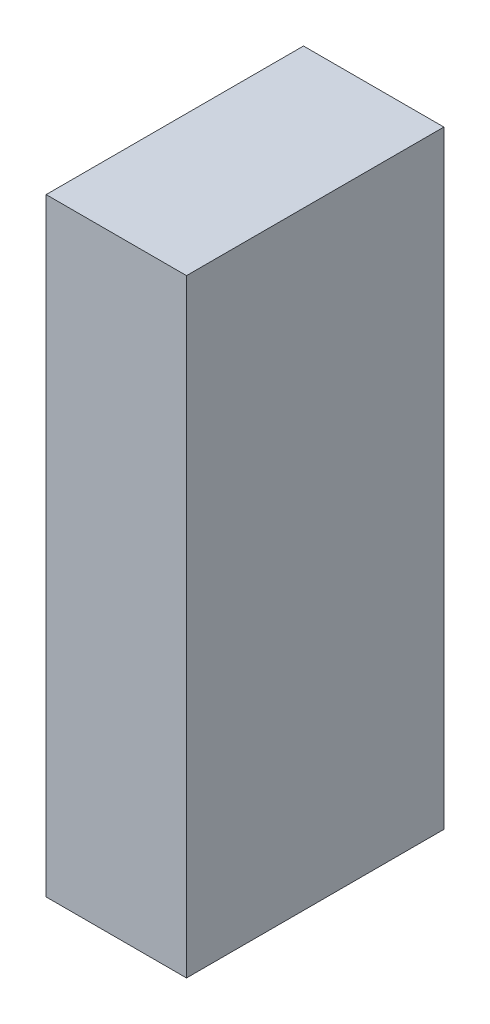
ISO-10303-21;
HEADER;
FILE_DESCRIPTION(('STEP AP214'),'2;1');
FILE_NAME('part.step','',(''),(''),'','','');
FILE_SCHEMA(('AUTOMOTIVE_DESIGN { 1 0 10303 214 1 1 1 1 }'));
ENDSEC;
DATA;
#1=APPLICATION_CONTEXT('core data for automotive mechanical design processes');
#2=APPLICATION_PROTOCOL_DEFINITION('international standard','automotive_design',2000,#1);
#3=PRODUCT_CONTEXT('',#1,'mechanical');
#4=PRODUCT('Part','Part','',(#3));
#5=PRODUCT_RELATED_PRODUCT_CATEGORY('part','',(#4));
#6=PRODUCT_DEFINITION_FORMATION('','',#4);
#7=PRODUCT_DEFINITION_CONTEXT('part definition',#1,'design');
#8=PRODUCT_DEFINITION('design','',#6,#7);
#9=PRODUCT_DEFINITION_SHAPE('','',#8);
#10=(LENGTH_UNIT() NAMED_UNIT(*) SI_UNIT(.MILLI.,.METRE.));
#11=(NAMED_UNIT(*) PLANE_ANGLE_UNIT() SI_UNIT($,.RADIAN.));
#12=(NAMED_UNIT(*) SI_UNIT($,.STERADIAN.) SOLID_ANGLE_UNIT());
#13=UNCERTAINTY_MEASURE_WITH_UNIT(LENGTH_MEASURE(1.E-05),#10,'distance_accuracy_value','');
#14=(GEOMETRIC_REPRESENTATION_CONTEXT(3) GLOBAL_UNCERTAINTY_ASSIGNED_CONTEXT((#13)) GLOBAL_UNIT_ASSIGNED_CONTEXT((#10,
#11,#12)) REPRESENTATION_CONTEXT('',''));
#15=CARTESIAN_POINT('',(0.,0.,0.));
#16=DIRECTION('',(0.,0.,1.));
#17=DIRECTION('',(1.,0.,0.));
#18=AXIS2_PLACEMENT_3D('',#15,#16,#17);
#19=CARTESIAN_POINT('',(300.,1300.,1100.));
#20=DIRECTION('',(-1.,0.,0.));
#21=DIRECTION('',(0.,-1.,0.));
#22=AXIS2_PLACEMENT_3D('',#19,#20,#21);
#23=PLANE('',#22);
#24=DIRECTION('',(0.,1.,0.));
#25=VECTOR('',#24,1.);
#26=CARTESIAN_POINT('',(300.,1300.,0.));
#27=LINE('',#26,#25);
#28=CARTESIAN_POINT('',(300.,-1300.,0.));
#29=VERTEX_POINT('',#28);
#30=CARTESIAN_POINT('',(300.,1300.,0.));
#31=VERTEX_POINT('',#30);
#32=EDGE_CURVE('E169',#29,#31,#27,.T.);
#33=ORIENTED_EDGE('',*,*,#32,.T.);
#34=DIRECTION('',(0.,0.,-1.));
#35=VECTOR('',#34,1.);
#36=CARTESIAN_POINT('',(300.,1300.,1100.));
#37=LINE('',#36,#35);
#38=CARTESIAN_POINT('',(300.,1300.,1100.));
#39=VERTEX_POINT('',#38);
#40=EDGE_CURVE('E11',#39,#31,#37,.T.);
#41=ORIENTED_EDGE('',*,*,#40,.F.);
#42=DIRECTION('',(0.,1.,0.));
#43=VECTOR('',#42,1.);
#44=CARTESIAN_POINT('',(300.,1300.,1100.));
#45=LINE('',#44,#43);
#46=CARTESIAN_POINT('',(300.,-1300.,1100.));
#47=VERTEX_POINT('',#46);
#48=EDGE_CURVE('E175',#47,#39,#45,.T.);
#49=ORIENTED_EDGE('',*,*,#48,.F.);
#50=DIRECTION('',(0.,0.,-1.));
#51=VECTOR('',#50,1.);
#52=CARTESIAN_POINT('',(300.,-1300.,1100.));
#53=LINE('',#52,#51);
#54=EDGE_CURVE('E185',#47,#29,#53,.T.);
#55=ORIENTED_EDGE('',*,*,#54,.T.);
#56=EDGE_LOOP('',(#33,#41,#49,#55));
#57=FACE_BOUND('',#56,.T.);
#58=ADVANCED_FACE('F49',(#57),#23,.F.);
#59=CARTESIAN_POINT('',(-300.,1300.,1100.));
#60=DIRECTION('',(0.,-1.,0.));
#61=DIRECTION('',(0.,0.,-1.));
#62=AXIS2_PLACEMENT_3D('',#59,#60,#61);
#63=PLANE('',#62);
#64=DIRECTION('',(-1.,0.,0.));
#65=VECTOR('',#64,1.);
#66=CARTESIAN_POINT('',(-300.,1300.,0.));
#67=LINE('',#66,#65);
#68=CARTESIAN_POINT('',(-300.,1300.,0.));
#69=VERTEX_POINT('',#68);
#70=EDGE_CURVE('E189',#31,#69,#67,.T.);
#71=ORIENTED_EDGE('',*,*,#70,.T.);
#72=DIRECTION('',(0.,0.,-1.));
#73=VECTOR('',#72,1.);
#74=CARTESIAN_POINT('',(-300.,1300.,1100.));
#75=LINE('',#74,#73);
#76=CARTESIAN_POINT('',(-300.,1300.,1100.));
#77=VERTEX_POINT('',#76);
#78=EDGE_CURVE('E57',#77,#69,#75,.T.);
#79=ORIENTED_EDGE('',*,*,#78,.F.);
#80=DIRECTION('',(-1.,0.,0.));
#81=VECTOR('',#80,1.);
#82=CARTESIAN_POINT('',(-300.,1300.,1100.));
#83=LINE('',#82,#81);
#84=EDGE_CURVE('E101',#39,#77,#83,.T.);
#85=ORIENTED_EDGE('',*,*,#84,.F.);
#86=ORIENTED_EDGE('',*,*,#40,.T.);
#87=EDGE_LOOP('',(#71,#79,#85,#86));
#88=FACE_BOUND('',#87,.T.);
#89=ADVANCED_FACE('F223',(#88),#63,.F.);
#90=CARTESIAN_POINT('',(-300.,1300.,1100.));
#91=DIRECTION('',(1.,0.,0.));
#92=DIRECTION('',(0.,1.,0.));
#93=AXIS2_PLACEMENT_3D('',#90,#91,#92);
#94=PLANE('',#93);
#95=DIRECTION('',(0.,-1.,0.));
#96=VECTOR('',#95,1.);
#97=CARTESIAN_POINT('',(-300.,1300.,0.));
#98=LINE('',#97,#96);
#99=CARTESIAN_POINT('',(-300.,-1300.,0.));
#100=VERTEX_POINT('',#99);
#101=EDGE_CURVE('E192',#69,#100,#98,.T.);
#102=ORIENTED_EDGE('',*,*,#101,.T.);
#103=DIRECTION('',(0.,0.,-1.));
#104=VECTOR('',#103,1.);
#105=CARTESIAN_POINT('',(-300.,-1300.,1100.));
#106=LINE('',#105,#104);
#107=CARTESIAN_POINT('',(-300.,-1300.,1100.));
#108=VERTEX_POINT('',#107);
#109=EDGE_CURVE('E199',#108,#100,#106,.T.);
#110=ORIENTED_EDGE('',*,*,#109,.F.);
#111=DIRECTION('',(0.,-1.,0.));
#112=VECTOR('',#111,1.);
#113=CARTESIAN_POINT('',(-300.,1300.,1100.));
#114=LINE('',#113,#112);
#115=EDGE_CURVE('E180',#77,#108,#114,.T.);
#116=ORIENTED_EDGE('',*,*,#115,.F.);
#117=ORIENTED_EDGE('',*,*,#78,.T.);
#118=EDGE_LOOP('',(#102,#110,#116,#117));
#119=FACE_BOUND('',#118,.T.);
#120=ADVANCED_FACE('F207',(#119),#94,.F.);
#121=CARTESIAN_POINT('',(-300.,-1300.,1100.));
#122=DIRECTION('',(0.,1.,0.));
#123=DIRECTION('',(0.,0.,1.));
#124=AXIS2_PLACEMENT_3D('',#121,#122,#123);
#125=PLANE('',#124);
#126=DIRECTION('',(1.,0.,0.));
#127=VECTOR('',#126,1.);
#128=CARTESIAN_POINT('',(-300.,-1300.,0.));
#129=LINE('',#128,#127);
#130=EDGE_CURVE('E94',#100,#29,#129,.T.);
#131=ORIENTED_EDGE('',*,*,#130,.T.);
#132=ORIENTED_EDGE('',*,*,#54,.F.);
#133=DIRECTION('',(1.,0.,0.));
#134=VECTOR('',#133,1.);
#135=CARTESIAN_POINT('',(-300.,-1300.,1100.));
#136=LINE('',#135,#134);
#137=EDGE_CURVE('E73',#108,#47,#136,.T.);
#138=ORIENTED_EDGE('',*,*,#137,.F.);
#139=ORIENTED_EDGE('',*,*,#109,.T.);
#140=EDGE_LOOP('',(#131,#132,#138,#139));
#141=FACE_BOUND('',#140,.T.);
#142=ADVANCED_FACE('F215',(#141),#125,.F.);
#143=CARTESIAN_POINT('',(0.,0.,1100.));
#144=DIRECTION('',(0.,0.,1.));
#145=DIRECTION('',(1.,0.,0.));
#146=AXIS2_PLACEMENT_3D('',#143,#144,#145);
#147=PLANE('',#146);
#148=ORIENTED_EDGE('',*,*,#48,.T.);
#149=ORIENTED_EDGE('',*,*,#84,.T.);
#150=ORIENTED_EDGE('',*,*,#115,.T.);
#151=ORIENTED_EDGE('',*,*,#137,.T.);
#152=EDGE_LOOP('',(#148,#149,#150,#151));
#153=FACE_BOUND('',#152,.T.);
#154=ADVANCED_FACE('F217',(#153),#147,.T.);
#155=CARTESIAN_POINT('',(0.,0.,0.));
#156=DIRECTION('',(0.,0.,1.));
#157=DIRECTION('',(1.,0.,0.));
#158=AXIS2_PLACEMENT_3D('',#155,#156,#157);
#159=PLANE('',#158);
#160=DIRECTION('',(1.,0.,0.));
#161=VECTOR('',#160,1.);
#162=CARTESIAN_POINT('',(49.9999999999996,-700.,0.));
#163=LINE('',#162,#161);
#164=CARTESIAN_POINT('',(-50.0000000000004,-700.,0.));
#165=VERTEX_POINT('',#164);
#166=CARTESIAN_POINT('',(49.9999999999996,-700.,0.));
#167=VERTEX_POINT('',#166);
#168=EDGE_CURVE('E160',#165,#167,#163,.T.);
#169=ORIENTED_EDGE('',*,*,#168,.F.);
#170=DIRECTION('',(0.,1.,0.));
#171=VECTOR('',#170,1.);
#172=CARTESIAN_POINT('',(-50.0000000000004,-700.,0.));
#173=LINE('',#172,#171);
#174=CARTESIAN_POINT('',(-50.0000000000004,-800.,0.));
#175=VERTEX_POINT('',#174);
#176=EDGE_CURVE('E64',#175,#165,#173,.T.);
#177=ORIENTED_EDGE('',*,*,#176,.F.);
#178=DIRECTION('',(-1.,0.,0.));
#179=VECTOR('',#178,1.);
#180=CARTESIAN_POINT('',(49.9999999999996,-800.,0.));
#181=LINE('',#180,#179);
#182=CARTESIAN_POINT('',(49.9999999999996,-800.,0.));
#183=VERTEX_POINT('',#182);
#184=EDGE_CURVE('E146',#183,#175,#181,.T.);
#185=ORIENTED_EDGE('',*,*,#184,.F.);
#186=DIRECTION('',(0.,-1.,0.));
#187=VECTOR('',#186,1.);
#188=CARTESIAN_POINT('',(49.9999999999996,-700.,0.));
#189=LINE('',#188,#187);
#190=EDGE_CURVE('E151',#167,#183,#189,.T.);
#191=ORIENTED_EDGE('',*,*,#190,.F.);
#192=EDGE_LOOP('',(#169,#177,#185,#191));
#193=FACE_BOUND('',#192,.T.);
#194=ORIENTED_EDGE('',*,*,#32,.F.);
#195=ORIENTED_EDGE('',*,*,#130,.F.);
#196=ORIENTED_EDGE('',*,*,#101,.F.);
#197=ORIENTED_EDGE('',*,*,#70,.F.);
#198=EDGE_LOOP('',(#194,#195,#196,#197));
#199=FACE_BOUND('',#198,.T.);
#200=ADVANCED_FACE('F211',(#193,#199),#159,.F.);
#201=CARTESIAN_POINT('',(-50.0000000000004,-700.,100.));
#202=DIRECTION('',(-1.,0.,0.));
#203=DIRECTION('',(0.,-1.,0.));
#204=AXIS2_PLACEMENT_3D('',#201,#202,#203);
#205=PLANE('',#204);
#206=ORIENTED_EDGE('',*,*,#176,.T.);
#207=DIRECTION('',(0.,0.,-1.));
#208=VECTOR('',#207,1.);
#209=CARTESIAN_POINT('',(-50.0000000000004,-700.,100.));
#210=LINE('',#209,#208);
#211=CARTESIAN_POINT('',(-50.0000000000004,-700.,100.));
#212=VERTEX_POINT('',#211);
#213=EDGE_CURVE('E121',#212,#165,#210,.T.);
#214=ORIENTED_EDGE('',*,*,#213,.F.);
#215=DIRECTION('',(0.,1.,0.));
#216=VECTOR('',#215,1.);
#217=CARTESIAN_POINT('',(-50.0000000000004,-700.,100.));
#218=LINE('',#217,#216);
#219=CARTESIAN_POINT('',(-50.0000000000004,-800.,100.));
#220=VERTEX_POINT('',#219);
#221=EDGE_CURVE('E125',#220,#212,#218,.T.);
#222=ORIENTED_EDGE('',*,*,#221,.F.);
#223=DIRECTION('',(0.,0.,-1.));
#224=VECTOR('',#223,1.);
#225=CARTESIAN_POINT('',(-50.0000000000004,-800.,100.));
#226=LINE('',#225,#224);
#227=EDGE_CURVE('E166',#220,#175,#226,.T.);
#228=ORIENTED_EDGE('',*,*,#227,.T.);
#229=EDGE_LOOP('',(#206,#214,#222,#228));
#230=FACE_BOUND('',#229,.T.);
#231=ADVANCED_FACE('F123',(#230),#205,.F.);
#232=CARTESIAN_POINT('',(49.9999999999996,-800.,100.));
#233=DIRECTION('',(0.,-1.,0.));
#234=DIRECTION('',(0.,0.,-1.));
#235=AXIS2_PLACEMENT_3D('',#232,#233,#234);
#236=PLANE('',#235);
#237=ORIENTED_EDGE('',*,*,#184,.T.);
#238=ORIENTED_EDGE('',*,*,#227,.F.);
#239=DIRECTION('',(-1.,0.,0.));
#240=VECTOR('',#239,1.);
#241=CARTESIAN_POINT('',(49.9999999999996,-800.,100.));
#242=LINE('',#241,#240);
#243=CARTESIAN_POINT('',(49.9999999999996,-800.,100.));
#244=VERTEX_POINT('',#243);
#245=EDGE_CURVE('E132',#244,#220,#242,.T.);
#246=ORIENTED_EDGE('',*,*,#245,.F.);
#247=DIRECTION('',(0.,0.,-1.));
#248=VECTOR('',#247,1.);
#249=CARTESIAN_POINT('',(49.9999999999996,-800.,100.));
#250=LINE('',#249,#248);
#251=EDGE_CURVE('E170',#244,#183,#250,.T.);
#252=ORIENTED_EDGE('',*,*,#251,.T.);
#253=EDGE_LOOP('',(#237,#238,#246,#252));
#254=FACE_BOUND('',#253,.T.);
#255=ADVANCED_FACE('F262',(#254),#236,.F.);
#256=CARTESIAN_POINT('',(49.9999999999996,-700.,100.));
#257=DIRECTION('',(1.,0.,0.));
#258=DIRECTION('',(0.,1.,0.));
#259=AXIS2_PLACEMENT_3D('',#256,#257,#258);
#260=PLANE('',#259);
#261=ORIENTED_EDGE('',*,*,#190,.T.);
#262=ORIENTED_EDGE('',*,*,#251,.F.);
#263=DIRECTION('',(0.,-1.,0.));
#264=VECTOR('',#263,1.);
#265=CARTESIAN_POINT('',(49.9999999999996,-700.,100.));
#266=LINE('',#265,#264);
#267=CARTESIAN_POINT('',(49.9999999999996,-700.,100.));
#268=VERTEX_POINT('',#267);
#269=EDGE_CURVE('E141',#268,#244,#266,.T.);
#270=ORIENTED_EDGE('',*,*,#269,.F.);
#271=DIRECTION('',(0.,0.,-1.));
#272=VECTOR('',#271,1.);
#273=CARTESIAN_POINT('',(49.9999999999996,-700.,100.));
#274=LINE('',#273,#272);
#275=EDGE_CURVE('E131',#268,#167,#274,.T.);
#276=ORIENTED_EDGE('',*,*,#275,.T.);
#277=EDGE_LOOP('',(#261,#262,#270,#276));
#278=FACE_BOUND('',#277,.T.);
#279=ADVANCED_FACE('F271',(#278),#260,.F.);
#280=CARTESIAN_POINT('',(49.9999999999996,-700.,100.));
#281=DIRECTION('',(0.,1.,0.));
#282=DIRECTION('',(0.,0.,1.));
#283=AXIS2_PLACEMENT_3D('',#280,#281,#282);
#284=PLANE('',#283);
#285=ORIENTED_EDGE('',*,*,#168,.T.);
#286=ORIENTED_EDGE('',*,*,#275,.F.);
#287=DIRECTION('',(1.,0.,0.));
#288=VECTOR('',#287,1.);
#289=CARTESIAN_POINT('',(49.9999999999996,-700.,100.));
#290=LINE('',#289,#288);
#291=EDGE_CURVE('E135',#212,#268,#290,.T.);
#292=ORIENTED_EDGE('',*,*,#291,.F.);
#293=ORIENTED_EDGE('',*,*,#213,.T.);
#294=EDGE_LOOP('',(#285,#286,#292,#293));
#295=FACE_BOUND('',#294,.T.);
#296=ADVANCED_FACE('F136',(#295),#284,.F.);
#297=CARTESIAN_POINT('',(0.,0.,100.));
#298=DIRECTION('',(0.,0.,-1.));
#299=DIRECTION('',(-1.,0.,0.));
#300=AXIS2_PLACEMENT_3D('',#297,#298,#299);
#301=PLANE('',#300);
#302=ORIENTED_EDGE('',*,*,#221,.T.);
#303=ORIENTED_EDGE('',*,*,#291,.T.);
#304=ORIENTED_EDGE('',*,*,#269,.T.);
#305=ORIENTED_EDGE('',*,*,#245,.T.);
#306=EDGE_LOOP('',(#302,#303,#304,#305));
#307=FACE_BOUND('',#306,.T.);
#308=ADVANCED_FACE('F143',(#307),#301,.T.);
#309=CLOSED_SHELL('',(#58,#89,#120,#142,#154,#200,#231,#255,#279,#296,#308));
#310=MANIFOLD_SOLID_BREP('B2',#309);
#311=ADVANCED_BREP_SHAPE_REPRESENTATION('',(#18,#310),#14);
#312=SHAPE_DEFINITION_REPRESENTATION(#9,#311);
ENDSEC;
END-ISO-10303-21;
